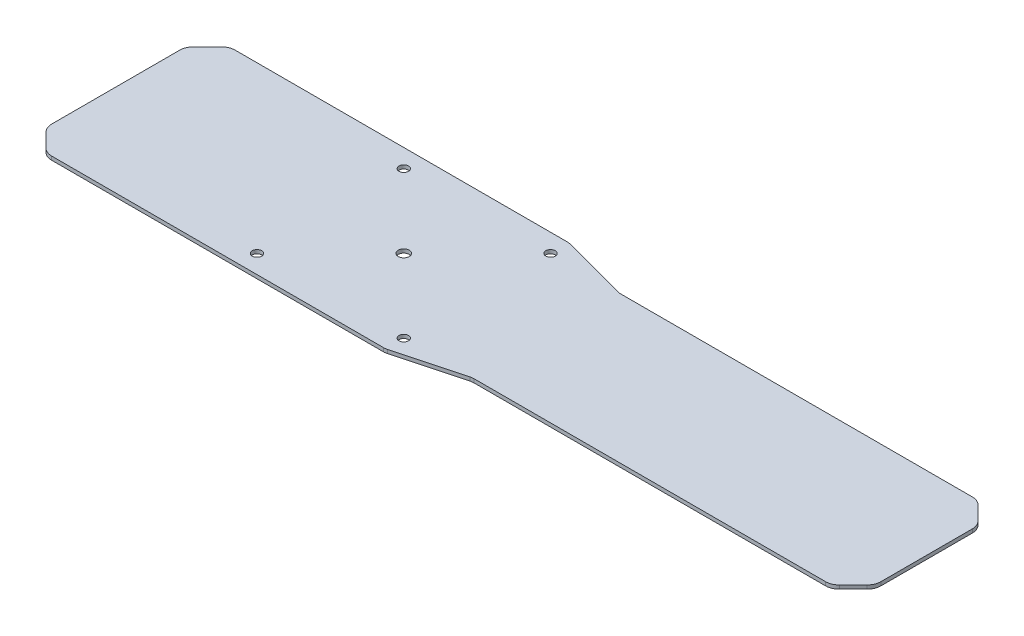
ISO-10303-21;
HEADER;
FILE_DESCRIPTION(('STEP AP214'),'2;1');
FILE_NAME('part.step','',(''),(''),'','','');
FILE_SCHEMA(('AUTOMOTIVE_DESIGN { 1 0 10303 214 1 1 1 1 }'));
ENDSEC;
DATA;
#1=APPLICATION_CONTEXT('core data for automotive mechanical design processes');
#2=APPLICATION_PROTOCOL_DEFINITION('international standard','automotive_design',2000,#1);
#3=PRODUCT_CONTEXT('',#1,'mechanical');
#4=PRODUCT('Part','Part','',(#3));
#5=PRODUCT_RELATED_PRODUCT_CATEGORY('part','',(#4));
#6=PRODUCT_DEFINITION_FORMATION('','',#4);
#7=PRODUCT_DEFINITION_CONTEXT('part definition',#1,'design');
#8=PRODUCT_DEFINITION('design','',#6,#7);
#9=PRODUCT_DEFINITION_SHAPE('','',#8);
#10=(LENGTH_UNIT() NAMED_UNIT(*) SI_UNIT(.MILLI.,.METRE.));
#11=(NAMED_UNIT(*) PLANE_ANGLE_UNIT() SI_UNIT($,.RADIAN.));
#12=(NAMED_UNIT(*) SI_UNIT($,.STERADIAN.) SOLID_ANGLE_UNIT());
#13=UNCERTAINTY_MEASURE_WITH_UNIT(LENGTH_MEASURE(1.E-05),#10,'distance_accuracy_value','');
#14=(GEOMETRIC_REPRESENTATION_CONTEXT(3) GLOBAL_UNCERTAINTY_ASSIGNED_CONTEXT((#13)) GLOBAL_UNIT_ASSIGNED_CONTEXT((#10,
#11,#12)) REPRESENTATION_CONTEXT('',''));
#15=CARTESIAN_POINT('',(0.,0.,0.));
#16=DIRECTION('',(0.,0.,1.));
#17=DIRECTION('',(1.,0.,0.));
#18=AXIS2_PLACEMENT_3D('',#15,#16,#17);
#19=CARTESIAN_POINT('',(40.,2.,50.));
#20=DIRECTION('',(-0.258819045102525,0.,-0.965925826289067));
#21=DIRECTION('',(-0.965925826289067,0.,0.258819045102525));
#22=AXIS2_PLACEMENT_3D('',#19,#20,#21);
#23=PLANE('',#22);
#24=DIRECTION('',(0.965925826289067,0.,-0.258819045102525));
#25=VECTOR('',#24,1.);
#26=CARTESIAN_POINT('',(40.,2.,50.));
#27=LINE('',#26,#25);
#28=CARTESIAN_POINT('',(40.9537491063635,2.,49.744443697168));
#29=VERTEX_POINT('',#28);
#30=CARTESIAN_POINT('',(76.3667589693253,2.,40.2555563028319));
#31=VERTEX_POINT('',#30);
#32=EDGE_CURVE('E223',#29,#31,#27,.T.);
#33=ORIENTED_EDGE('',*,*,#32,.F.);
#34=DIRECTION('',(0.,-1.,0.));
#35=VECTOR('',#34,1.);
#36=CARTESIAN_POINT('',(40.9537491063635,2.,49.744443697168));
#37=LINE('',#36,#35);
#38=CARTESIAN_POINT('',(40.9537491063635,0.,49.744443697168));
#39=VERTEX_POINT('',#38);
#40=EDGE_CURVE('E207',#29,#39,#37,.T.);
#41=ORIENTED_EDGE('',*,*,#40,.T.);
#42=DIRECTION('',(0.965925826289067,0.,-0.258819045102525));
#43=VECTOR('',#42,1.);
#44=CARTESIAN_POINT('',(40.,0.,50.));
#45=LINE('',#44,#43);
#46=CARTESIAN_POINT('',(76.3667589693253,0.,40.2555563028319));
#47=VERTEX_POINT('',#46);
#48=EDGE_CURVE('E220',#39,#47,#45,.T.);
#49=ORIENTED_EDGE('',*,*,#48,.T.);
#50=DIRECTION('',(0.,-1.,0.));
#51=VECTOR('',#50,1.);
#52=CARTESIAN_POINT('',(76.3667589693253,2.,40.2555563028319));
#53=LINE('',#52,#51);
#54=EDGE_CURVE('E226',#47,#31,#53,.F.);
#55=ORIENTED_EDGE('',*,*,#54,.T.);
#56=EDGE_LOOP('',(#33,#41,#49,#55));
#57=FACE_BOUND('',#56,.T.);
#58=ADVANCED_FACE('F41',(#57),#23,.F.);
#59=CARTESIAN_POINT('',(77.3205080756887,2.,39.9999999999999));
#60=DIRECTION('',(0.,0.,-1.));
#61=DIRECTION('',(-1.,0.,0.));
#62=AXIS2_PLACEMENT_3D('',#59,#60,#61);
#63=PLANE('',#62);
#64=DIRECTION('',(1.,0.,0.));
#65=VECTOR('',#64,1.);
#66=CARTESIAN_POINT('',(77.3205080756887,2.,39.9999999999999));
#67=LINE('',#66,#65);
#68=CARTESIAN_POINT('',(78.3079018075942,2.,39.9999999999999));
#69=VERTEX_POINT('',#68);
#70=CARTESIAN_POINT('',(269.893398282202,2.,39.9999999999999));
#71=VERTEX_POINT('',#70);
#72=EDGE_CURVE('E469',#69,#71,#67,.T.);
#73=ORIENTED_EDGE('',*,*,#72,.F.);
#74=DIRECTION('',(0.,-1.,0.));
#75=VECTOR('',#74,1.);
#76=CARTESIAN_POINT('',(78.3079018075942,0.,39.9999999999999));
#77=LINE('',#76,#75);
#78=CARTESIAN_POINT('',(78.3079018075942,0.,39.9999999999999));
#79=VERTEX_POINT('',#78);
#80=EDGE_CURVE('E366',#69,#79,#77,.T.);
#81=ORIENTED_EDGE('',*,*,#80,.T.);
#82=DIRECTION('',(1.,0.,0.));
#83=VECTOR('',#82,1.);
#84=CARTESIAN_POINT('',(77.3205080756887,0.,39.9999999999999));
#85=LINE('',#84,#83);
#86=CARTESIAN_POINT('',(269.893398282202,0.,39.9999999999999));
#87=VERTEX_POINT('',#86);
#88=EDGE_CURVE('E232',#79,#87,#85,.T.);
#89=ORIENTED_EDGE('',*,*,#88,.T.);
#90=DIRECTION('',(0.,-1.,0.));
#91=VECTOR('',#90,1.);
#92=CARTESIAN_POINT('',(269.893398282202,2.,39.9999999999999));
#93=LINE('',#92,#91);
#94=EDGE_CURVE('E362',#87,#71,#93,.F.);
#95=ORIENTED_EDGE('',*,*,#94,.T.);
#96=EDGE_LOOP('',(#73,#81,#89,#95));
#97=FACE_BOUND('',#96,.T.);
#98=ADVANCED_FACE('F541',(#97),#63,.F.);
#99=CARTESIAN_POINT('',(285.,2.,-40.0000000000001));
#100=DIRECTION('',(-1.,0.,0.));
#101=DIRECTION('',(0.,0.,1.));
#102=AXIS2_PLACEMENT_3D('',#99,#100,#101);
#103=PLANE('',#102);
#104=DIRECTION('',(0.,0.,-1.));
#105=VECTOR('',#104,1.);
#106=CARTESIAN_POINT('',(285.,2.,-40.0000000000001));
#107=LINE('',#106,#105);
#108=CARTESIAN_POINT('',(285.,2.,24.8933982822017));
#109=VERTEX_POINT('',#108);
#110=CARTESIAN_POINT('',(285.,2.,-24.8933982822019));
#111=VERTEX_POINT('',#110);
#112=EDGE_CURVE('E463',#109,#111,#107,.T.);
#113=ORIENTED_EDGE('',*,*,#112,.F.);
#114=DIRECTION('',(0.,1.,0.));
#115=VECTOR('',#114,1.);
#116=CARTESIAN_POINT('',(285.,0.,24.8933982822017));
#117=LINE('',#116,#115);
#118=CARTESIAN_POINT('',(285.,0.,24.8933982822017));
#119=VERTEX_POINT('',#118);
#120=EDGE_CURVE('E421',#109,#119,#117,.F.);
#121=ORIENTED_EDGE('',*,*,#120,.T.);
#122=DIRECTION('',(0.,0.,-1.));
#123=VECTOR('',#122,1.);
#124=CARTESIAN_POINT('',(285.,0.,-40.0000000000001));
#125=LINE('',#124,#123);
#126=CARTESIAN_POINT('',(285.,0.,-24.8933982822019));
#127=VERTEX_POINT('',#126);
#128=EDGE_CURVE('E238',#119,#127,#125,.T.);
#129=ORIENTED_EDGE('',*,*,#128,.T.);
#130=DIRECTION('',(0.,-1.,0.));
#131=VECTOR('',#130,1.);
#132=CARTESIAN_POINT('',(285.,2.,-24.8933982822019));
#133=LINE('',#132,#131);
#134=EDGE_CURVE('E417',#127,#111,#133,.F.);
#135=ORIENTED_EDGE('',*,*,#134,.T.);
#136=EDGE_LOOP('',(#113,#121,#129,#135));
#137=FACE_BOUND('',#136,.T.);
#138=ADVANCED_FACE('F546',(#137),#103,.F.);
#139=CARTESIAN_POINT('',(77.3205080756887,2.,-40.0000000000001));
#140=DIRECTION('',(0.,0.,1.));
#141=DIRECTION('',(1.,0.,0.));
#142=AXIS2_PLACEMENT_3D('',#139,#140,#141);
#143=PLANE('',#142);
#144=DIRECTION('',(-1.,0.,0.));
#145=VECTOR('',#144,1.);
#146=CARTESIAN_POINT('',(77.3205080756887,0.,-40.0000000000001));
#147=LINE('',#146,#145);
#148=CARTESIAN_POINT('',(269.893398282202,0.,-40.0000000000001));
#149=VERTEX_POINT('',#148);
#150=CARTESIAN_POINT('',(78.3079018075941,0.,-40.0000000000001));
#151=VERTEX_POINT('',#150);
#152=EDGE_CURVE('E250',#149,#151,#147,.T.);
#153=ORIENTED_EDGE('',*,*,#152,.T.);
#154=DIRECTION('',(0.,-1.,0.));
#155=VECTOR('',#154,1.);
#156=CARTESIAN_POINT('',(78.3079018075941,2.,-40.0000000000001));
#157=LINE('',#156,#155);
#158=CARTESIAN_POINT('',(78.3079018075941,2.,-40.0000000000001));
#159=VERTEX_POINT('',#158);
#160=EDGE_CURVE('E381',#151,#159,#157,.F.);
#161=ORIENTED_EDGE('',*,*,#160,.T.);
#162=DIRECTION('',(-1.,0.,0.));
#163=VECTOR('',#162,1.);
#164=CARTESIAN_POINT('',(77.3205080756887,2.,-40.0000000000001));
#165=LINE('',#164,#163);
#166=CARTESIAN_POINT('',(269.893398282202,2.,-40.0000000000001));
#167=VERTEX_POINT('',#166);
#168=EDGE_CURVE('E454',#167,#159,#165,.T.);
#169=ORIENTED_EDGE('',*,*,#168,.F.);
#170=DIRECTION('',(0.,1.,0.));
#171=VECTOR('',#170,1.);
#172=CARTESIAN_POINT('',(269.893398282202,0.,-40.0000000000001));
#173=LINE('',#172,#171);
#174=EDGE_CURVE('E377',#167,#149,#173,.F.);
#175=ORIENTED_EDGE('',*,*,#174,.T.);
#176=EDGE_LOOP('',(#153,#161,#169,#175));
#177=FACE_BOUND('',#176,.T.);
#178=ADVANCED_FACE('F442',(#177),#143,.F.);
#179=CARTESIAN_POINT('',(40.,2.,-50.));
#180=DIRECTION('',(-0.258819045102517,0.,0.965925826289069));
#181=DIRECTION('',(0.965925826289069,0.,0.258819045102517));
#182=AXIS2_PLACEMENT_3D('',#179,#180,#181);
#183=PLANE('',#182);
#184=DIRECTION('',(-0.965925826289069,0.,-0.258819045102517));
#185=VECTOR('',#184,1.);
#186=CARTESIAN_POINT('',(40.,2.,-50.));
#187=LINE('',#186,#185);
#188=CARTESIAN_POINT('',(76.3667589693252,2.,-40.2555563028321));
#189=VERTEX_POINT('',#188);
#190=CARTESIAN_POINT('',(40.9537491063634,2.,-49.744443697168));
#191=VERTEX_POINT('',#190);
#192=EDGE_CURVE('E452',#189,#191,#187,.T.);
#193=ORIENTED_EDGE('',*,*,#192,.F.);
#194=DIRECTION('',(0.,-1.,0.));
#195=VECTOR('',#194,1.);
#196=CARTESIAN_POINT('',(76.3667589693252,0.,-40.2555563028321));
#197=LINE('',#196,#195);
#198=CARTESIAN_POINT('',(76.3667589693252,0.,-40.2555563028321));
#199=VERTEX_POINT('',#198);
#200=EDGE_CURVE('E373',#189,#199,#197,.T.);
#201=ORIENTED_EDGE('',*,*,#200,.T.);
#202=DIRECTION('',(-0.965925826289069,0.,-0.258819045102517));
#203=VECTOR('',#202,1.);
#204=CARTESIAN_POINT('',(40.,0.,-50.));
#205=LINE('',#204,#203);
#206=CARTESIAN_POINT('',(40.9537491063634,0.,-49.744443697168));
#207=VERTEX_POINT('',#206);
#208=EDGE_CURVE('E254',#199,#207,#205,.T.);
#209=ORIENTED_EDGE('',*,*,#208,.T.);
#210=DIRECTION('',(0.,-1.,0.));
#211=VECTOR('',#210,1.);
#212=CARTESIAN_POINT('',(40.9537491063634,2.,-49.744443697168));
#213=LINE('',#212,#211);
#214=EDGE_CURVE('E370',#207,#191,#213,.F.);
#215=ORIENTED_EDGE('',*,*,#214,.T.);
#216=EDGE_LOOP('',(#193,#201,#209,#215));
#217=FACE_BOUND('',#216,.T.);
#218=ADVANCED_FACE('F456',(#217),#183,.F.);
#219=CARTESIAN_POINT('',(-40.,2.,-50.));
#220=DIRECTION('',(0.,0.,1.));
#221=DIRECTION('',(1.,0.,0.));
#222=AXIS2_PLACEMENT_3D('',#219,#220,#221);
#223=PLANE('',#222);
#224=DIRECTION('',(-1.,0.,0.));
#225=VECTOR('',#224,1.);
#226=CARTESIAN_POINT('',(-40.,2.,-50.));
#227=LINE('',#226,#225);
#228=CARTESIAN_POINT('',(39.0126062680945,2.,-50.));
#229=VERTEX_POINT('',#228);
#230=CARTESIAN_POINT('',(-141.893398282202,2.,-50.));
#231=VERTEX_POINT('',#230);
#232=EDGE_CURVE('E459',#229,#231,#227,.T.);
#233=ORIENTED_EDGE('',*,*,#232,.F.);
#234=DIRECTION('',(0.,-1.,0.));
#235=VECTOR('',#234,1.);
#236=CARTESIAN_POINT('',(39.0126062680945,2.,-50.));
#237=LINE('',#236,#235);
#238=CARTESIAN_POINT('',(39.0126062680945,0.,-50.));
#239=VERTEX_POINT('',#238);
#240=EDGE_CURVE('E388',#229,#239,#237,.T.);
#241=ORIENTED_EDGE('',*,*,#240,.T.);
#242=DIRECTION('',(-1.,0.,0.));
#243=VECTOR('',#242,1.);
#244=CARTESIAN_POINT('',(-40.,0.,-50.));
#245=LINE('',#244,#243);
#246=CARTESIAN_POINT('',(-141.893398282202,0.,-50.));
#247=VERTEX_POINT('',#246);
#248=EDGE_CURVE('E258',#239,#247,#245,.T.);
#249=ORIENTED_EDGE('',*,*,#248,.T.);
#250=DIRECTION('',(0.,-1.,0.));
#251=VECTOR('',#250,1.);
#252=CARTESIAN_POINT('',(-141.893398282202,2.,-50.));
#253=LINE('',#252,#251);
#254=EDGE_CURVE('E384',#247,#231,#253,.F.);
#255=ORIENTED_EDGE('',*,*,#254,.T.);
#256=EDGE_LOOP('',(#233,#241,#249,#255));
#257=FACE_BOUND('',#256,.T.);
#258=ADVANCED_FACE('F658',(#257),#223,.F.);
#259=CARTESIAN_POINT('',(-157.,2.,-50.));
#260=DIRECTION('',(1.,0.,0.));
#261=DIRECTION('',(0.,0.,-1.));
#262=AXIS2_PLACEMENT_3D('',#259,#260,#261);
#263=PLANE('',#262);
#264=DIRECTION('',(0.,0.,1.));
#265=VECTOR('',#264,1.);
#266=CARTESIAN_POINT('',(-157.,2.,-50.));
#267=LINE('',#266,#265);
#268=CARTESIAN_POINT('',(-157.,2.,-34.8933982822017));
#269=VERTEX_POINT('',#268);
#270=CARTESIAN_POINT('',(-157.,2.,34.8933982822018));
#271=VERTEX_POINT('',#270);
#272=EDGE_CURVE('E244',#269,#271,#267,.T.);
#273=ORIENTED_EDGE('',*,*,#272,.F.);
#274=DIRECTION('',(0.,1.,0.));
#275=VECTOR('',#274,1.);
#276=CARTESIAN_POINT('',(-157.,0.,-34.8933982822017));
#277=LINE('',#276,#275);
#278=CARTESIAN_POINT('',(-157.,0.,-34.8933982822017));
#279=VERTEX_POINT('',#278);
#280=EDGE_CURVE('E401',#269,#279,#277,.F.);
#281=ORIENTED_EDGE('',*,*,#280,.T.);
#282=DIRECTION('',(0.,0.,1.));
#283=VECTOR('',#282,1.);
#284=CARTESIAN_POINT('',(-157.,0.,-50.));
#285=LINE('',#284,#283);
#286=CARTESIAN_POINT('',(-157.,0.,34.8933982822018));
#287=VERTEX_POINT('',#286);
#288=EDGE_CURVE('E262',#279,#287,#285,.T.);
#289=ORIENTED_EDGE('',*,*,#288,.T.);
#290=DIRECTION('',(0.,-1.,0.));
#291=VECTOR('',#290,1.);
#292=CARTESIAN_POINT('',(-157.,2.,34.8933982822018));
#293=LINE('',#292,#291);
#294=EDGE_CURVE('E397',#287,#271,#293,.F.);
#295=ORIENTED_EDGE('',*,*,#294,.T.);
#296=EDGE_LOOP('',(#273,#281,#289,#295));
#297=FACE_BOUND('',#296,.T.);
#298=ADVANCED_FACE('F648',(#297),#263,.F.);
#299=CARTESIAN_POINT('',(-40.,2.,50.));
#300=DIRECTION('',(0.,0.,-1.));
#301=DIRECTION('',(-1.,0.,0.));
#302=AXIS2_PLACEMENT_3D('',#299,#300,#301);
#303=PLANE('',#302);
#304=DIRECTION('',(1.,0.,0.));
#305=VECTOR('',#304,1.);
#306=CARTESIAN_POINT('',(-40.,0.,50.));
#307=LINE('',#306,#305);
#308=CARTESIAN_POINT('',(-141.893398282202,0.,50.));
#309=VERTEX_POINT('',#308);
#310=CARTESIAN_POINT('',(39.0126062680945,0.,50.));
#311=VERTEX_POINT('',#310);
#312=EDGE_CURVE('E266',#309,#311,#307,.T.);
#313=ORIENTED_EDGE('',*,*,#312,.T.);
#314=DIRECTION('',(0.,-1.,0.));
#315=VECTOR('',#314,1.);
#316=CARTESIAN_POINT('',(39.0126062680945,2.,50.));
#317=LINE('',#316,#315);
#318=CARTESIAN_POINT('',(39.0126062680945,2.,50.));
#319=VERTEX_POINT('',#318);
#320=EDGE_CURVE('E208',#311,#319,#317,.F.);
#321=ORIENTED_EDGE('',*,*,#320,.T.);
#322=DIRECTION('',(1.,0.,0.));
#323=VECTOR('',#322,1.);
#324=CARTESIAN_POINT('',(-40.,2.,50.));
#325=LINE('',#324,#323);
#326=CARTESIAN_POINT('',(-141.893398282202,2.,50.));
#327=VERTEX_POINT('',#326);
#328=EDGE_CURVE('E269',#327,#319,#325,.T.);
#329=ORIENTED_EDGE('',*,*,#328,.F.);
#330=DIRECTION('',(0.,1.,0.));
#331=VECTOR('',#330,1.);
#332=CARTESIAN_POINT('',(-141.893398282202,0.,50.));
#333=LINE('',#332,#331);
#334=EDGE_CURVE('E214',#327,#309,#333,.F.);
#335=ORIENTED_EDGE('',*,*,#334,.T.);
#336=EDGE_LOOP('',(#313,#321,#329,#335));
#337=FACE_BOUND('',#336,.T.);
#338=ADVANCED_FACE('F525',(#337),#303,.F.);
#339=CARTESIAN_POINT('',(0.,2.,0.));
#340=DIRECTION('',(0.,-1.,0.));
#341=DIRECTION('',(0.,0.,-1.));
#342=AXIS2_PLACEMENT_3D('',#339,#340,#341);
#343=PLANE('',#342);
#344=CARTESIAN_POINT('',(0.,2.,0.));
#345=DIRECTION('',(0.,1.,0.));
#346=DIRECTION('',(0.,0.,1.));
#347=AXIS2_PLACEMENT_3D('',#344,#345,#346);
#348=CIRCLE('',#347,3.);
#349=CARTESIAN_POINT('',(0.,2.,3.00000000000002));
#350=VERTEX_POINT('',#349);
#351=EDGE_CURVE('E481',#350,#350,#348,.T.);
#352=ORIENTED_EDGE('',*,*,#351,.F.);
#353=EDGE_LOOP('',(#352));
#354=FACE_BOUND('',#353,.T.);
#355=CARTESIAN_POINT('',(-40.,2.,40.));
#356=DIRECTION('',(0.,1.,0.));
#357=DIRECTION('',(0.,0.,-1.));
#358=AXIS2_PLACEMENT_3D('',#355,#356,#357);
#359=CIRCLE('',#358,2.57499999999999);
#360=CARTESIAN_POINT('',(-40.,2.,37.425));
#361=VERTEX_POINT('',#360);
#362=EDGE_CURVE('E489',#361,#361,#359,.T.);
#363=ORIENTED_EDGE('',*,*,#362,.F.);
#364=EDGE_LOOP('',(#363));
#365=FACE_BOUND('',#364,.T.);
#366=CARTESIAN_POINT('',(39.9999999999999,2.,40.));
#367=DIRECTION('',(0.,1.,0.));
#368=DIRECTION('',(0.,0.,1.));
#369=AXIS2_PLACEMENT_3D('',#366,#367,#368);
#370=CIRCLE('',#369,2.575);
#371=CARTESIAN_POINT('',(39.9999999999999,2.,42.575));
#372=VERTEX_POINT('',#371);
#373=EDGE_CURVE('E497',#372,#372,#370,.T.);
#374=ORIENTED_EDGE('',*,*,#373,.F.);
#375=EDGE_LOOP('',(#374));
#376=FACE_BOUND('',#375,.T.);
#377=CARTESIAN_POINT('',(40.,2.,-40.));
#378=DIRECTION('',(0.,1.,0.));
#379=DIRECTION('',(0.,0.,-1.));
#380=AXIS2_PLACEMENT_3D('',#377,#378,#379);
#381=CIRCLE('',#380,2.575);
#382=CARTESIAN_POINT('',(40.,2.,-42.575));
#383=VERTEX_POINT('',#382);
#384=EDGE_CURVE('E505',#383,#383,#381,.T.);
#385=ORIENTED_EDGE('',*,*,#384,.F.);
#386=EDGE_LOOP('',(#385));
#387=FACE_BOUND('',#386,.T.);
#388=CARTESIAN_POINT('',(-40.,2.,-40.));
#389=DIRECTION('',(0.,1.,0.));
#390=DIRECTION('',(0.,0.,1.));
#391=AXIS2_PLACEMENT_3D('',#388,#389,#390);
#392=CIRCLE('',#391,2.575);
#393=CARTESIAN_POINT('',(-40.,2.,-37.425));
#394=VERTEX_POINT('',#393);
#395=EDGE_CURVE('E241',#394,#394,#392,.T.);
#396=ORIENTED_EDGE('',*,*,#395,.F.);
#397=EDGE_LOOP('',(#396));
#398=FACE_BOUND('',#397,.T.);
#399=ORIENTED_EDGE('',*,*,#328,.T.);
#400=CARTESIAN_POINT('',(39.0126062680945,2.,42.5));
#401=DIRECTION('',(0.,-1.,0.));
#402=DIRECTION('',(0.,0.,-1.));
#403=AXIS2_PLACEMENT_3D('',#400,#401,#402);
#404=CIRCLE('',#403,7.5);
#405=EDGE_CURVE('E359',#319,#29,#404,.F.);
#406=ORIENTED_EDGE('',*,*,#405,.T.);
#407=ORIENTED_EDGE('',*,*,#32,.T.);
#408=CARTESIAN_POINT('',(78.3079018075942,2.,47.4999999999999));
#409=DIRECTION('',(0.,-1.,0.));
#410=DIRECTION('',(0.,0.,-1.));
#411=AXIS2_PLACEMENT_3D('',#408,#409,#410);
#412=CIRCLE('',#411,7.5);
#413=EDGE_CURVE('E433',#31,#69,#412,.T.);
#414=ORIENTED_EDGE('',*,*,#413,.T.);
#415=ORIENTED_EDGE('',*,*,#72,.T.);
#416=CARTESIAN_POINT('',(269.893398282202,2.,32.4999999999999));
#417=DIRECTION('',(0.,-1.,0.));
#418=DIRECTION('',(0.,0.,-1.));
#419=AXIS2_PLACEMENT_3D('',#416,#417,#418);
#420=CIRCLE('',#419,7.5);
#421=CARTESIAN_POINT('',(275.196699141101,2.,37.8033008588989));
#422=VERTEX_POINT('',#421);
#423=EDGE_CURVE('E342',#71,#422,#420,.F.);
#424=ORIENTED_EDGE('',*,*,#423,.T.);
#425=DIRECTION('',(-0.707106781186549,0.,0.707106781186546));
#426=VECTOR('',#425,1.);
#427=CARTESIAN_POINT('',(285.,2.,27.9999999999999));
#428=LINE('',#427,#426);
#429=CARTESIAN_POINT('',(282.803300858899,2.,30.1966991411008));
#430=VERTEX_POINT('',#429);
#431=EDGE_CURVE('E286',#422,#430,#428,.F.);
#432=ORIENTED_EDGE('',*,*,#431,.T.);
#433=CARTESIAN_POINT('',(277.5,2.,24.8933982822017));
#434=DIRECTION('',(0.,-1.,0.));
#435=DIRECTION('',(0.,0.,-1.));
#436=AXIS2_PLACEMENT_3D('',#433,#434,#435);
#437=CIRCLE('',#436,7.5);
#438=EDGE_CURVE('E339',#430,#109,#437,.F.);
#439=ORIENTED_EDGE('',*,*,#438,.T.);
#440=ORIENTED_EDGE('',*,*,#112,.T.);
#441=CARTESIAN_POINT('',(277.5,2.,-24.8933982822019));
#442=DIRECTION('',(0.,-1.,0.));
#443=DIRECTION('',(0.,0.,-1.));
#444=AXIS2_PLACEMENT_3D('',#441,#442,#443);
#445=CIRCLE('',#444,7.5);
#446=CARTESIAN_POINT('',(282.803300858899,2.,-30.196699141101));
#447=VERTEX_POINT('',#446);
#448=EDGE_CURVE('E336',#111,#447,#445,.F.);
#449=ORIENTED_EDGE('',*,*,#448,.T.);
#450=DIRECTION('',(0.707106781186546,0.,0.707106781186549));
#451=VECTOR('',#450,1.);
#452=CARTESIAN_POINT('',(273.,2.,-40.0000000000001));
#453=LINE('',#452,#451);
#454=CARTESIAN_POINT('',(275.196699141101,2.,-37.8033008588992));
#455=VERTEX_POINT('',#454);
#456=EDGE_CURVE('E290',#447,#455,#453,.F.);
#457=ORIENTED_EDGE('',*,*,#456,.T.);
#458=CARTESIAN_POINT('',(269.893398282202,2.,-32.5000000000001));
#459=DIRECTION('',(0.,-1.,0.));
#460=DIRECTION('',(0.,0.,-1.));
#461=AXIS2_PLACEMENT_3D('',#458,#459,#460);
#462=CIRCLE('',#461,7.5);
#463=EDGE_CURVE('E333',#455,#167,#462,.F.);
#464=ORIENTED_EDGE('',*,*,#463,.T.);
#465=ORIENTED_EDGE('',*,*,#168,.T.);
#466=CARTESIAN_POINT('',(78.3079018075941,2.,-47.5000000000001));
#467=DIRECTION('',(0.,-1.,0.));
#468=DIRECTION('',(0.,0.,-1.));
#469=AXIS2_PLACEMENT_3D('',#466,#467,#468);
#470=CIRCLE('',#469,7.5);
#471=EDGE_CURVE('E11',#159,#189,#470,.T.);
#472=ORIENTED_EDGE('',*,*,#471,.T.);
#473=ORIENTED_EDGE('',*,*,#192,.T.);
#474=CARTESIAN_POINT('',(39.0126062680945,2.,-42.5));
#475=DIRECTION('',(0.,-1.,0.));
#476=DIRECTION('',(0.,0.,-1.));
#477=AXIS2_PLACEMENT_3D('',#474,#475,#476);
#478=CIRCLE('',#477,7.5);
#479=EDGE_CURVE('E356',#191,#229,#478,.F.);
#480=ORIENTED_EDGE('',*,*,#479,.T.);
#481=ORIENTED_EDGE('',*,*,#232,.T.);
#482=CARTESIAN_POINT('',(-141.893398282202,2.,-42.5));
#483=DIRECTION('',(0.,-1.,0.));
#484=DIRECTION('',(0.,0.,-1.));
#485=AXIS2_PLACEMENT_3D('',#482,#483,#484);
#486=CIRCLE('',#485,7.5);
#487=CARTESIAN_POINT('',(-147.196699141101,2.,-47.8033008588991));
#488=VERTEX_POINT('',#487);
#489=EDGE_CURVE('E64',#231,#488,#486,.F.);
#490=ORIENTED_EDGE('',*,*,#489,.T.);
#491=DIRECTION('',(0.707106781186549,0.,-0.707106781186546));
#492=VECTOR('',#491,1.);
#493=CARTESIAN_POINT('',(-157.,2.,-38.));
#494=LINE('',#493,#492);
#495=CARTESIAN_POINT('',(-154.803300858899,2.,-40.1966991411009));
#496=VERTEX_POINT('',#495);
#497=EDGE_CURVE('E294',#488,#496,#494,.F.);
#498=ORIENTED_EDGE('',*,*,#497,.T.);
#499=CARTESIAN_POINT('',(-149.5,2.,-34.8933982822017));
#500=DIRECTION('',(0.,-1.,0.));
#501=DIRECTION('',(0.,0.,-1.));
#502=AXIS2_PLACEMENT_3D('',#499,#500,#501);
#503=CIRCLE('',#502,7.5);
#504=EDGE_CURVE('E351',#496,#269,#503,.F.);
#505=ORIENTED_EDGE('',*,*,#504,.T.);
#506=ORIENTED_EDGE('',*,*,#272,.T.);
#507=CARTESIAN_POINT('',(-149.5,2.,34.8933982822018));
#508=DIRECTION('',(0.,-1.,0.));
#509=DIRECTION('',(0.,0.,-1.));
#510=AXIS2_PLACEMENT_3D('',#507,#508,#509);
#511=CIRCLE('',#510,7.5);
#512=CARTESIAN_POINT('',(-154.803300858899,2.,40.1966991411009));
#513=VERTEX_POINT('',#512);
#514=EDGE_CURVE('E348',#271,#513,#511,.F.);
#515=ORIENTED_EDGE('',*,*,#514,.T.);
#516=DIRECTION('',(-0.707106781186546,0.,-0.707106781186549));
#517=VECTOR('',#516,1.);
#518=CARTESIAN_POINT('',(-145.,2.,50.));
#519=LINE('',#518,#517);
#520=CARTESIAN_POINT('',(-147.196699141101,2.,47.8033008588991));
#521=VERTEX_POINT('',#520);
#522=EDGE_CURVE('E297',#513,#521,#519,.F.);
#523=ORIENTED_EDGE('',*,*,#522,.T.);
#524=CARTESIAN_POINT('',(-141.893398282202,2.,42.5));
#525=DIRECTION('',(0.,-1.,0.));
#526=DIRECTION('',(0.,0.,-1.));
#527=AXIS2_PLACEMENT_3D('',#524,#525,#526);
#528=CIRCLE('',#527,7.5);
#529=EDGE_CURVE('E345',#521,#327,#528,.F.);
#530=ORIENTED_EDGE('',*,*,#529,.T.);
#531=EDGE_LOOP('',(#399,#406,#407,#414,#415,#424,#432,#439,#440,#449,#457,#464,#465,#472,#473,
#480,#481,#490,#498,#505,#506,#515,#523,#530));
#532=FACE_BOUND('',#531,.T.);
#533=ADVANCED_FACE('F451',(#354,#365,#376,#387,#398,#532),#343,.F.);
#534=CARTESIAN_POINT('',(0.,0.,0.));
#535=DIRECTION('',(0.,-1.,0.));
#536=DIRECTION('',(0.,0.,-1.));
#537=AXIS2_PLACEMENT_3D('',#534,#535,#536);
#538=PLANE('',#537);
#539=CARTESIAN_POINT('',(0.,0.,0.));
#540=DIRECTION('',(0.,1.,0.));
#541=DIRECTION('',(0.,0.,1.));
#542=AXIS2_PLACEMENT_3D('',#539,#540,#541);
#543=CIRCLE('',#542,3.);
#544=CARTESIAN_POINT('',(0.,0.,3.00000000000002));
#545=VERTEX_POINT('',#544);
#546=EDGE_CURVE('E485',#545,#545,#543,.T.);
#547=ORIENTED_EDGE('',*,*,#546,.T.);
#548=EDGE_LOOP('',(#547));
#549=FACE_BOUND('',#548,.T.);
#550=CARTESIAN_POINT('',(-40.,0.,40.));
#551=DIRECTION('',(0.,1.,0.));
#552=DIRECTION('',(0.,0.,-1.));
#553=AXIS2_PLACEMENT_3D('',#550,#551,#552);
#554=CIRCLE('',#553,2.57499999999999);
#555=CARTESIAN_POINT('',(-40.,0.,37.425));
#556=VERTEX_POINT('',#555);
#557=EDGE_CURVE('E493',#556,#556,#554,.T.);
#558=ORIENTED_EDGE('',*,*,#557,.T.);
#559=EDGE_LOOP('',(#558));
#560=FACE_BOUND('',#559,.T.);
#561=CARTESIAN_POINT('',(39.9999999999999,0.,40.));
#562=DIRECTION('',(0.,1.,0.));
#563=DIRECTION('',(0.,0.,1.));
#564=AXIS2_PLACEMENT_3D('',#561,#562,#563);
#565=CIRCLE('',#564,2.575);
#566=CARTESIAN_POINT('',(39.9999999999999,0.,42.575));
#567=VERTEX_POINT('',#566);
#568=EDGE_CURVE('E501',#567,#567,#565,.T.);
#569=ORIENTED_EDGE('',*,*,#568,.T.);
#570=EDGE_LOOP('',(#569));
#571=FACE_BOUND('',#570,.T.);
#572=CARTESIAN_POINT('',(40.,0.,-40.));
#573=DIRECTION('',(0.,1.,0.));
#574=DIRECTION('',(0.,0.,-1.));
#575=AXIS2_PLACEMENT_3D('',#572,#573,#574);
#576=CIRCLE('',#575,2.575);
#577=CARTESIAN_POINT('',(40.,0.,-42.575));
#578=VERTEX_POINT('',#577);
#579=EDGE_CURVE('E479',#578,#578,#576,.T.);
#580=ORIENTED_EDGE('',*,*,#579,.T.);
#581=EDGE_LOOP('',(#580));
#582=FACE_BOUND('',#581,.T.);
#583=CARTESIAN_POINT('',(-40.,0.,-40.));
#584=DIRECTION('',(0.,1.,0.));
#585=DIRECTION('',(0.,0.,1.));
#586=AXIS2_PLACEMENT_3D('',#583,#584,#585);
#587=CIRCLE('',#586,2.575);
#588=CARTESIAN_POINT('',(-40.,0.,-37.425));
#589=VERTEX_POINT('',#588);
#590=EDGE_CURVE('E233',#589,#589,#587,.T.);
#591=ORIENTED_EDGE('',*,*,#590,.T.);
#592=EDGE_LOOP('',(#591));
#593=FACE_BOUND('',#592,.T.);
#594=ORIENTED_EDGE('',*,*,#48,.F.);
#595=CARTESIAN_POINT('',(39.0126062680945,0.,42.5));
#596=DIRECTION('',(0.,-1.,0.));
#597=DIRECTION('',(0.,0.,-1.));
#598=AXIS2_PLACEMENT_3D('',#595,#596,#597);
#599=CIRCLE('',#598,7.5);
#600=EDGE_CURVE('E203',#39,#311,#599,.T.);
#601=ORIENTED_EDGE('',*,*,#600,.T.);
#602=ORIENTED_EDGE('',*,*,#312,.F.);
#603=CARTESIAN_POINT('',(-141.893398282202,0.,42.5));
#604=DIRECTION('',(0.,-1.,0.));
#605=DIRECTION('',(0.,0.,-1.));
#606=AXIS2_PLACEMENT_3D('',#603,#604,#605);
#607=CIRCLE('',#606,7.5);
#608=CARTESIAN_POINT('',(-147.196699141101,0.,47.8033008588992));
#609=VERTEX_POINT('',#608);
#610=EDGE_CURVE('E314',#309,#609,#607,.T.);
#611=ORIENTED_EDGE('',*,*,#610,.T.);
#612=DIRECTION('',(0.707106781186546,0.,0.707106781186549));
#613=VECTOR('',#612,1.);
#614=CARTESIAN_POINT('',(-97.5000000000004,0.,97.4999999999999));
#615=LINE('',#614,#613);
#616=CARTESIAN_POINT('',(-154.803300858899,0.,40.1966991411009));
#617=VERTEX_POINT('',#616);
#618=EDGE_CURVE('E282',#609,#617,#615,.F.);
#619=ORIENTED_EDGE('',*,*,#618,.T.);
#620=CARTESIAN_POINT('',(-149.5,0.,34.8933982822018));
#621=DIRECTION('',(0.,-1.,0.));
#622=DIRECTION('',(0.,0.,-1.));
#623=AXIS2_PLACEMENT_3D('',#620,#621,#622);
#624=CIRCLE('',#623,7.5);
#625=EDGE_CURVE('E317',#617,#287,#624,.T.);
#626=ORIENTED_EDGE('',*,*,#625,.T.);
#627=ORIENTED_EDGE('',*,*,#288,.F.);
#628=CARTESIAN_POINT('',(-149.5,0.,-34.8933982822017));
#629=DIRECTION('',(0.,-1.,0.));
#630=DIRECTION('',(0.,0.,-1.));
#631=AXIS2_PLACEMENT_3D('',#628,#629,#630);
#632=CIRCLE('',#631,7.5);
#633=CARTESIAN_POINT('',(-154.803300858899,0.,-40.1966991411008));
#634=VERTEX_POINT('',#633);
#635=EDGE_CURVE('E320',#279,#634,#632,.T.);
#636=ORIENTED_EDGE('',*,*,#635,.T.);
#637=DIRECTION('',(-0.707106781186549,0.,0.707106781186546));
#638=VECTOR('',#637,1.);
#639=CARTESIAN_POINT('',(-97.4999999999996,0.,-97.5000000000001));
#640=LINE('',#639,#638);
#641=CARTESIAN_POINT('',(-147.196699141101,0.,-47.8033008588991));
#642=VERTEX_POINT('',#641);
#643=EDGE_CURVE('E278',#634,#642,#640,.F.);
#644=ORIENTED_EDGE('',*,*,#643,.T.);
#645=CARTESIAN_POINT('',(-141.893398282202,0.,-42.5));
#646=DIRECTION('',(0.,-1.,0.));
#647=DIRECTION('',(0.,0.,-1.));
#648=AXIS2_PLACEMENT_3D('',#645,#646,#647);
#649=CIRCLE('',#648,7.5);
#650=EDGE_CURVE('E323',#642,#247,#649,.T.);
#651=ORIENTED_EDGE('',*,*,#650,.T.);
#652=ORIENTED_EDGE('',*,*,#248,.F.);
#653=CARTESIAN_POINT('',(39.0126062680945,0.,-42.5));
#654=DIRECTION('',(0.,-1.,0.));
#655=DIRECTION('',(0.,0.,-1.));
#656=AXIS2_PLACEMENT_3D('',#653,#654,#655);
#657=CIRCLE('',#656,7.5);
#658=EDGE_CURVE('E215',#239,#207,#657,.T.);
#659=ORIENTED_EDGE('',*,*,#658,.T.);
#660=ORIENTED_EDGE('',*,*,#208,.F.);
#661=CARTESIAN_POINT('',(78.3079018075941,0.,-47.5000000000001));
#662=DIRECTION('',(0.,-1.,0.));
#663=DIRECTION('',(0.,0.,-1.));
#664=AXIS2_PLACEMENT_3D('',#661,#662,#663);
#665=CIRCLE('',#664,7.5);
#666=EDGE_CURVE('E50',#199,#151,#665,.F.);
#667=ORIENTED_EDGE('',*,*,#666,.T.);
#668=ORIENTED_EDGE('',*,*,#152,.F.);
#669=CARTESIAN_POINT('',(269.893398282202,0.,-32.5000000000001));
#670=DIRECTION('',(0.,-1.,0.));
#671=DIRECTION('',(0.,0.,-1.));
#672=AXIS2_PLACEMENT_3D('',#669,#670,#671);
#673=CIRCLE('',#672,7.5);
#674=CARTESIAN_POINT('',(275.196699141101,0.,-37.8033008588992));
#675=VERTEX_POINT('',#674);
#676=EDGE_CURVE('E225',#149,#675,#673,.T.);
#677=ORIENTED_EDGE('',*,*,#676,.T.);
#678=DIRECTION('',(-0.707106781186546,0.,-0.707106781186549));
#679=VECTOR('',#678,1.);
#680=CARTESIAN_POINT('',(156.500000000001,0.,-156.5));
#681=LINE('',#680,#679);
#682=CARTESIAN_POINT('',(282.803300858899,0.,-30.196699141101));
#683=VERTEX_POINT('',#682);
#684=EDGE_CURVE('E274',#675,#683,#681,.F.);
#685=ORIENTED_EDGE('',*,*,#684,.T.);
#686=CARTESIAN_POINT('',(277.5,0.,-24.8933982822019));
#687=DIRECTION('',(0.,-1.,0.));
#688=DIRECTION('',(0.,0.,-1.));
#689=AXIS2_PLACEMENT_3D('',#686,#687,#688);
#690=CIRCLE('',#689,7.5);
#691=EDGE_CURVE('E305',#683,#127,#690,.T.);
#692=ORIENTED_EDGE('',*,*,#691,.T.);
#693=ORIENTED_EDGE('',*,*,#128,.F.);
#694=CARTESIAN_POINT('',(277.5,0.,24.8933982822017));
#695=DIRECTION('',(0.,-1.,0.));
#696=DIRECTION('',(0.,0.,-1.));
#697=AXIS2_PLACEMENT_3D('',#694,#695,#696);
#698=CIRCLE('',#697,7.5);
#699=CARTESIAN_POINT('',(282.803300858899,0.,30.1966991411007));
#700=VERTEX_POINT('',#699);
#701=EDGE_CURVE('E308',#119,#700,#698,.T.);
#702=ORIENTED_EDGE('',*,*,#701,.T.);
#703=DIRECTION('',(0.707106781186549,0.,-0.707106781186546));
#704=VECTOR('',#703,1.);
#705=CARTESIAN_POINT('',(156.499999999999,0.,156.5));
#706=LINE('',#705,#704);
#707=CARTESIAN_POINT('',(275.196699141101,0.,37.8033008588989));
#708=VERTEX_POINT('',#707);
#709=EDGE_CURVE('E270',#700,#708,#706,.F.);
#710=ORIENTED_EDGE('',*,*,#709,.T.);
#711=CARTESIAN_POINT('',(269.893398282202,0.,32.4999999999999));
#712=DIRECTION('',(0.,-1.,0.));
#713=DIRECTION('',(0.,0.,-1.));
#714=AXIS2_PLACEMENT_3D('',#711,#712,#713);
#715=CIRCLE('',#714,7.5);
#716=EDGE_CURVE('E311',#708,#87,#715,.T.);
#717=ORIENTED_EDGE('',*,*,#716,.T.);
#718=ORIENTED_EDGE('',*,*,#88,.F.);
#719=CARTESIAN_POINT('',(78.3079018075942,0.,47.4999999999999));
#720=DIRECTION('',(0.,-1.,0.));
#721=DIRECTION('',(0.,0.,-1.));
#722=AXIS2_PLACEMENT_3D('',#719,#720,#721);
#723=CIRCLE('',#722,7.5);
#724=EDGE_CURVE('E230',#79,#47,#723,.F.);
#725=ORIENTED_EDGE('',*,*,#724,.T.);
#726=EDGE_LOOP('',(#594,#601,#602,#611,#619,#626,#627,#636,#644,#651,#652,#659,#660,#667,#668,
#677,#685,#692,#693,#702,#710,#717,#718,#725));
#727=FACE_BOUND('',#726,.T.);
#728=ADVANCED_FACE('F228',(#549,#560,#571,#582,#593,#727),#538,.T.);
#729=CARTESIAN_POINT('',(-145.,2.,50.));
#730=DIRECTION('',(0.707106781186549,0.,-0.707106781186546));
#731=DIRECTION('',(0.,-1.,0.));
#732=AXIS2_PLACEMENT_3D('',#729,#730,#731);
#733=PLANE('',#732);
#734=ORIENTED_EDGE('',*,*,#522,.F.);
#735=DIRECTION('',(0.,1.,0.));
#736=VECTOR('',#735,1.);
#737=CARTESIAN_POINT('',(-154.803300858899,0.,40.1966991411009));
#738=LINE('',#737,#736);
#739=EDGE_CURVE('E408',#513,#617,#738,.F.);
#740=ORIENTED_EDGE('',*,*,#739,.T.);
#741=ORIENTED_EDGE('',*,*,#618,.F.);
#742=DIRECTION('',(0.,-1.,0.));
#743=VECTOR('',#742,1.);
#744=CARTESIAN_POINT('',(-147.196699141101,2.,47.8033008588991));
#745=LINE('',#744,#743);
#746=EDGE_CURVE('E405',#609,#521,#745,.F.);
#747=ORIENTED_EDGE('',*,*,#746,.T.);
#748=EDGE_LOOP('',(#734,#740,#741,#747));
#749=FACE_BOUND('',#748,.T.);
#750=ADVANCED_FACE('F552',(#749),#733,.F.);
#751=CARTESIAN_POINT('',(-157.,2.,-38.));
#752=DIRECTION('',(0.707106781186546,0.,0.707106781186549));
#753=DIRECTION('',(0.,-1.,0.));
#754=AXIS2_PLACEMENT_3D('',#751,#752,#753);
#755=PLANE('',#754);
#756=ORIENTED_EDGE('',*,*,#497,.F.);
#757=DIRECTION('',(0.,1.,0.));
#758=VECTOR('',#757,1.);
#759=CARTESIAN_POINT('',(-147.196699141101,0.,-47.8033008588991));
#760=LINE('',#759,#758);
#761=EDGE_CURVE('E394',#488,#642,#760,.F.);
#762=ORIENTED_EDGE('',*,*,#761,.T.);
#763=ORIENTED_EDGE('',*,*,#643,.F.);
#764=DIRECTION('',(0.,-1.,0.));
#765=VECTOR('',#764,1.);
#766=CARTESIAN_POINT('',(-154.803300858899,2.,-40.1966991411009));
#767=LINE('',#766,#765);
#768=EDGE_CURVE('E57',#634,#496,#767,.F.);
#769=ORIENTED_EDGE('',*,*,#768,.T.);
#770=EDGE_LOOP('',(#756,#762,#763,#769));
#771=FACE_BOUND('',#770,.T.);
#772=ADVANCED_FACE('F558',(#771),#755,.F.);
#773=CARTESIAN_POINT('',(273.,2.,-40.0000000000001));
#774=DIRECTION('',(-0.707106781186549,0.,0.707106781186546));
#775=DIRECTION('',(0.,-1.,0.));
#776=AXIS2_PLACEMENT_3D('',#773,#774,#775);
#777=PLANE('',#776);
#778=ORIENTED_EDGE('',*,*,#456,.F.);
#779=DIRECTION('',(0.,1.,0.));
#780=VECTOR('',#779,1.);
#781=CARTESIAN_POINT('',(282.803300858899,0.,-30.196699141101));
#782=LINE('',#781,#780);
#783=EDGE_CURVE('E428',#447,#683,#782,.F.);
#784=ORIENTED_EDGE('',*,*,#783,.T.);
#785=ORIENTED_EDGE('',*,*,#684,.F.);
#786=DIRECTION('',(0.,-1.,0.));
#787=VECTOR('',#786,1.);
#788=CARTESIAN_POINT('',(275.196699141101,2.,-37.8033008588992));
#789=LINE('',#788,#787);
#790=EDGE_CURVE('E425',#675,#455,#789,.F.);
#791=ORIENTED_EDGE('',*,*,#790,.T.);
#792=EDGE_LOOP('',(#778,#784,#785,#791));
#793=FACE_BOUND('',#792,.T.);
#794=ADVANCED_FACE('F565',(#793),#777,.F.);
#795=CARTESIAN_POINT('',(285.,2.,27.9999999999999));
#796=DIRECTION('',(-0.707106781186546,0.,-0.707106781186549));
#797=DIRECTION('',(0.,-1.,0.));
#798=AXIS2_PLACEMENT_3D('',#795,#796,#797);
#799=PLANE('',#798);
#800=ORIENTED_EDGE('',*,*,#431,.F.);
#801=DIRECTION('',(0.,1.,0.));
#802=VECTOR('',#801,1.);
#803=CARTESIAN_POINT('',(275.196699141101,0.,37.803300858899));
#804=LINE('',#803,#802);
#805=EDGE_CURVE('E414',#422,#708,#804,.F.);
#806=ORIENTED_EDGE('',*,*,#805,.T.);
#807=ORIENTED_EDGE('',*,*,#709,.F.);
#808=DIRECTION('',(0.,-1.,0.));
#809=VECTOR('',#808,1.);
#810=CARTESIAN_POINT('',(282.803300858899,2.,30.1966991411008));
#811=LINE('',#810,#809);
#812=EDGE_CURVE('E411',#700,#430,#811,.F.);
#813=ORIENTED_EDGE('',*,*,#812,.T.);
#814=EDGE_LOOP('',(#800,#806,#807,#813));
#815=FACE_BOUND('',#814,.T.);
#816=ADVANCED_FACE('F571',(#815),#799,.F.);
#817=CARTESIAN_POINT('',(39.0126062680945,2.,42.5));
#818=DIRECTION('',(0.,-1.,0.));
#819=DIRECTION('',(0.,0.,-1.));
#820=AXIS2_PLACEMENT_3D('',#817,#818,#819);
#821=CYLINDRICAL_SURFACE('',#820,7.5);
#822=ORIENTED_EDGE('',*,*,#405,.F.);
#823=ORIENTED_EDGE('',*,*,#320,.F.);
#824=ORIENTED_EDGE('',*,*,#600,.F.);
#825=ORIENTED_EDGE('',*,*,#40,.F.);
#826=EDGE_LOOP('',(#822,#823,#824,#825));
#827=FACE_BOUND('',#826,.T.);
#828=ADVANCED_FACE('F206',(#827),#821,.T.);
#829=CARTESIAN_POINT('',(78.3079018075942,2.,47.4999999999999));
#830=DIRECTION('',(0.,1.,0.));
#831=DIRECTION('',(0.,0.,1.));
#832=AXIS2_PLACEMENT_3D('',#829,#830,#831);
#833=CYLINDRICAL_SURFACE('',#832,7.5);
#834=ORIENTED_EDGE('',*,*,#413,.F.);
#835=ORIENTED_EDGE('',*,*,#54,.F.);
#836=ORIENTED_EDGE('',*,*,#724,.F.);
#837=ORIENTED_EDGE('',*,*,#80,.F.);
#838=EDGE_LOOP('',(#834,#835,#836,#837));
#839=FACE_BOUND('',#838,.T.);
#840=ADVANCED_FACE('F580',(#839),#833,.F.);
#841=CARTESIAN_POINT('',(78.3079018075941,2.,-47.5000000000001));
#842=DIRECTION('',(0.,1.,0.));
#843=DIRECTION('',(0.,0.,1.));
#844=AXIS2_PLACEMENT_3D('',#841,#842,#843);
#845=CYLINDRICAL_SURFACE('',#844,7.5);
#846=ORIENTED_EDGE('',*,*,#471,.F.);
#847=ORIENTED_EDGE('',*,*,#160,.F.);
#848=ORIENTED_EDGE('',*,*,#666,.F.);
#849=ORIENTED_EDGE('',*,*,#200,.F.);
#850=EDGE_LOOP('',(#846,#847,#848,#849));
#851=FACE_BOUND('',#850,.T.);
#852=ADVANCED_FACE('F447',(#851),#845,.F.);
#853=CARTESIAN_POINT('',(39.0126062680945,2.,-42.5));
#854=DIRECTION('',(0.,-1.,0.));
#855=DIRECTION('',(0.,0.,-1.));
#856=AXIS2_PLACEMENT_3D('',#853,#854,#855);
#857=CYLINDRICAL_SURFACE('',#856,7.5);
#858=ORIENTED_EDGE('',*,*,#479,.F.);
#859=ORIENTED_EDGE('',*,*,#214,.F.);
#860=ORIENTED_EDGE('',*,*,#658,.F.);
#861=ORIENTED_EDGE('',*,*,#240,.F.);
#862=EDGE_LOOP('',(#858,#859,#860,#861));
#863=FACE_BOUND('',#862,.T.);
#864=ADVANCED_FACE('F586',(#863),#857,.T.);
#865=CARTESIAN_POINT('',(-141.893398282202,2.,-42.5));
#866=DIRECTION('',(0.,1.,0.));
#867=DIRECTION('',(0.,0.,1.));
#868=AXIS2_PLACEMENT_3D('',#865,#866,#867);
#869=CYLINDRICAL_SURFACE('',#868,7.5);
#870=ORIENTED_EDGE('',*,*,#650,.F.);
#871=ORIENTED_EDGE('',*,*,#761,.F.);
#872=ORIENTED_EDGE('',*,*,#489,.F.);
#873=ORIENTED_EDGE('',*,*,#254,.F.);
#874=EDGE_LOOP('',(#870,#871,#872,#873));
#875=FACE_BOUND('',#874,.T.);
#876=ADVANCED_FACE('F589',(#875),#869,.T.);
#877=CARTESIAN_POINT('',(-149.5,2.,-34.8933982822017));
#878=DIRECTION('',(0.,-1.,0.));
#879=DIRECTION('',(0.,0.,-1.));
#880=AXIS2_PLACEMENT_3D('',#877,#878,#879);
#881=CYLINDRICAL_SURFACE('',#880,7.5);
#882=ORIENTED_EDGE('',*,*,#504,.F.);
#883=ORIENTED_EDGE('',*,*,#768,.F.);
#884=ORIENTED_EDGE('',*,*,#635,.F.);
#885=ORIENTED_EDGE('',*,*,#280,.F.);
#886=EDGE_LOOP('',(#882,#883,#884,#885));
#887=FACE_BOUND('',#886,.T.);
#888=ADVANCED_FACE('F593',(#887),#881,.T.);
#889=CARTESIAN_POINT('',(-149.5,2.,34.8933982822018));
#890=DIRECTION('',(0.,1.,0.));
#891=DIRECTION('',(0.,0.,1.));
#892=AXIS2_PLACEMENT_3D('',#889,#890,#891);
#893=CYLINDRICAL_SURFACE('',#892,7.5);
#894=ORIENTED_EDGE('',*,*,#625,.F.);
#895=ORIENTED_EDGE('',*,*,#739,.F.);
#896=ORIENTED_EDGE('',*,*,#514,.F.);
#897=ORIENTED_EDGE('',*,*,#294,.F.);
#898=EDGE_LOOP('',(#894,#895,#896,#897));
#899=FACE_BOUND('',#898,.T.);
#900=ADVANCED_FACE('F597',(#899),#893,.T.);
#901=CARTESIAN_POINT('',(-141.893398282202,2.,42.5));
#902=DIRECTION('',(0.,-1.,0.));
#903=DIRECTION('',(0.,0.,-1.));
#904=AXIS2_PLACEMENT_3D('',#901,#902,#903);
#905=CYLINDRICAL_SURFACE('',#904,7.5);
#906=ORIENTED_EDGE('',*,*,#529,.F.);
#907=ORIENTED_EDGE('',*,*,#746,.F.);
#908=ORIENTED_EDGE('',*,*,#610,.F.);
#909=ORIENTED_EDGE('',*,*,#334,.F.);
#910=EDGE_LOOP('',(#906,#907,#908,#909));
#911=FACE_BOUND('',#910,.T.);
#912=ADVANCED_FACE('F601',(#911),#905,.T.);
#913=CARTESIAN_POINT('',(269.893398282202,2.,32.4999999999999));
#914=DIRECTION('',(0.,1.,0.));
#915=DIRECTION('',(0.,0.,1.));
#916=AXIS2_PLACEMENT_3D('',#913,#914,#915);
#917=CYLINDRICAL_SURFACE('',#916,7.5);
#918=ORIENTED_EDGE('',*,*,#716,.F.);
#919=ORIENTED_EDGE('',*,*,#805,.F.);
#920=ORIENTED_EDGE('',*,*,#423,.F.);
#921=ORIENTED_EDGE('',*,*,#94,.F.);
#922=EDGE_LOOP('',(#918,#919,#920,#921));
#923=FACE_BOUND('',#922,.T.);
#924=ADVANCED_FACE('F605',(#923),#917,.T.);
#925=CARTESIAN_POINT('',(277.5,2.,24.8933982822017));
#926=DIRECTION('',(0.,-1.,0.));
#927=DIRECTION('',(0.,0.,-1.));
#928=AXIS2_PLACEMENT_3D('',#925,#926,#927);
#929=CYLINDRICAL_SURFACE('',#928,7.5);
#930=ORIENTED_EDGE('',*,*,#438,.F.);
#931=ORIENTED_EDGE('',*,*,#812,.F.);
#932=ORIENTED_EDGE('',*,*,#701,.F.);
#933=ORIENTED_EDGE('',*,*,#120,.F.);
#934=EDGE_LOOP('',(#930,#931,#932,#933));
#935=FACE_BOUND('',#934,.T.);
#936=ADVANCED_FACE('F609',(#935),#929,.T.);
#937=CARTESIAN_POINT('',(277.5,2.,-24.8933982822019));
#938=DIRECTION('',(0.,1.,0.));
#939=DIRECTION('',(0.,0.,1.));
#940=AXIS2_PLACEMENT_3D('',#937,#938,#939);
#941=CYLINDRICAL_SURFACE('',#940,7.5);
#942=ORIENTED_EDGE('',*,*,#691,.F.);
#943=ORIENTED_EDGE('',*,*,#783,.F.);
#944=ORIENTED_EDGE('',*,*,#448,.F.);
#945=ORIENTED_EDGE('',*,*,#134,.F.);
#946=EDGE_LOOP('',(#942,#943,#944,#945));
#947=FACE_BOUND('',#946,.T.);
#948=ADVANCED_FACE('F536',(#947),#941,.T.);
#949=CARTESIAN_POINT('',(269.893398282202,2.,-32.5000000000001));
#950=DIRECTION('',(0.,-1.,0.));
#951=DIRECTION('',(0.,0.,-1.));
#952=AXIS2_PLACEMENT_3D('',#949,#950,#951);
#953=CYLINDRICAL_SURFACE('',#952,7.5);
#954=ORIENTED_EDGE('',*,*,#463,.F.);
#955=ORIENTED_EDGE('',*,*,#790,.F.);
#956=ORIENTED_EDGE('',*,*,#676,.F.);
#957=ORIENTED_EDGE('',*,*,#174,.F.);
#958=EDGE_LOOP('',(#954,#955,#956,#957));
#959=FACE_BOUND('',#958,.T.);
#960=ADVANCED_FACE('F43',(#959),#953,.T.);
#961=CARTESIAN_POINT('',(-40.,0.,-40.));
#962=DIRECTION('',(0.,1.,0.));
#963=DIRECTION('',(0.,0.,1.));
#964=AXIS2_PLACEMENT_3D('',#961,#962,#963);
#965=CYLINDRICAL_SURFACE('',#964,2.575);
#966=ORIENTED_EDGE('',*,*,#590,.F.);
#967=EDGE_LOOP('',(#966));
#968=FACE_BOUND('',#967,.T.);
#969=ORIENTED_EDGE('',*,*,#395,.T.);
#970=EDGE_LOOP('',(#969));
#971=FACE_BOUND('',#970,.T.);
#972=ADVANCED_FACE('F519',(#968,#971),#965,.F.);
#973=CARTESIAN_POINT('',(40.,0.,-40.));
#974=DIRECTION('',(0.,1.,0.));
#975=DIRECTION('',(0.,0.,1.));
#976=AXIS2_PLACEMENT_3D('',#973,#974,#975);
#977=CYLINDRICAL_SURFACE('',#976,2.575);
#978=ORIENTED_EDGE('',*,*,#579,.F.);
#979=EDGE_LOOP('',(#978));
#980=FACE_BOUND('',#979,.T.);
#981=ORIENTED_EDGE('',*,*,#384,.T.);
#982=EDGE_LOOP('',(#981));
#983=FACE_BOUND('',#982,.T.);
#984=ADVANCED_FACE('F515',(#980,#983),#977,.F.);
#985=CARTESIAN_POINT('',(39.9999999999999,0.,40.));
#986=DIRECTION('',(0.,1.,0.));
#987=DIRECTION('',(0.,0.,1.));
#988=AXIS2_PLACEMENT_3D('',#985,#986,#987);
#989=CYLINDRICAL_SURFACE('',#988,2.575);
#990=ORIENTED_EDGE('',*,*,#568,.F.);
#991=EDGE_LOOP('',(#990));
#992=FACE_BOUND('',#991,.T.);
#993=ORIENTED_EDGE('',*,*,#373,.T.);
#994=EDGE_LOOP('',(#993));
#995=FACE_BOUND('',#994,.T.);
#996=ADVANCED_FACE('F518',(#992,#995),#989,.F.);
#997=CARTESIAN_POINT('',(-40.,0.,40.));
#998=DIRECTION('',(0.,1.,0.));
#999=DIRECTION('',(0.,0.,1.));
#1000=AXIS2_PLACEMENT_3D('',#997,#998,#999);
#1001=CYLINDRICAL_SURFACE('',#1000,2.57499999999999);
#1002=ORIENTED_EDGE('',*,*,#557,.F.);
#1003=EDGE_LOOP('',(#1002));
#1004=FACE_BOUND('',#1003,.T.);
#1005=ORIENTED_EDGE('',*,*,#362,.T.);
#1006=EDGE_LOOP('',(#1005));
#1007=FACE_BOUND('',#1006,.T.);
#1008=ADVANCED_FACE('F831',(#1004,#1007),#1001,.F.);
#1009=CARTESIAN_POINT('',(0.,0.,0.));
#1010=DIRECTION('',(0.,1.,0.));
#1011=DIRECTION('',(0.,0.,1.));
#1012=AXIS2_PLACEMENT_3D('',#1009,#1010,#1011);
#1013=CYLINDRICAL_SURFACE('',#1012,3.);
#1014=ORIENTED_EDGE('',*,*,#546,.F.);
#1015=EDGE_LOOP('',(#1014));
#1016=FACE_BOUND('',#1015,.T.);
#1017=ORIENTED_EDGE('',*,*,#351,.T.);
#1018=EDGE_LOOP('',(#1017));
#1019=FACE_BOUND('',#1018,.T.);
#1020=ADVANCED_FACE('F841',(#1016,#1019),#1013,.F.);
#1021=CLOSED_SHELL('',(#58,#98,#138,#178,#218,#258,#298,#338,#533,#728,#750,#772,#794,#816,#828,
#840,#852,#864,#876,#888,#900,#912,#924,#936,#948,#960,#972,#984,#996,#1008,#1020));
#1022=MANIFOLD_SOLID_BREP('B2',#1021);
#1023=ADVANCED_BREP_SHAPE_REPRESENTATION('',(#18,#1022),#14);
#1024=SHAPE_DEFINITION_REPRESENTATION(#9,#1023);
ENDSEC;
END-ISO-10303-21;
